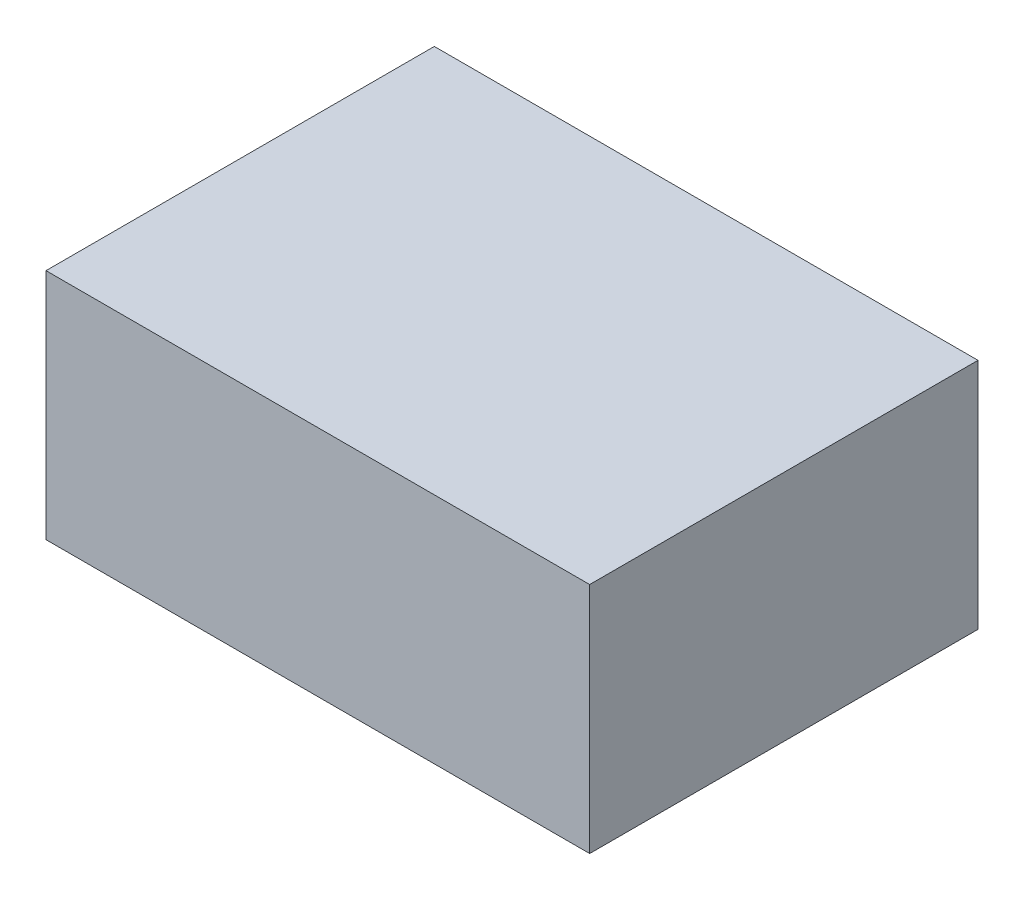
ISO-10303-21;
HEADER;
FILE_DESCRIPTION(('STEP AP214'),'2;1');
FILE_NAME('part.step','',(''),(''),'','','');
FILE_SCHEMA(('AUTOMOTIVE_DESIGN { 1 0 10303 214 1 1 1 1 }'));
ENDSEC;
DATA;
#1=APPLICATION_CONTEXT('core data for automotive mechanical design processes');
#2=APPLICATION_PROTOCOL_DEFINITION('international standard','automotive_design',2000,#1);
#3=PRODUCT_CONTEXT('',#1,'mechanical');
#4=PRODUCT('Part','Part','',(#3));
#5=PRODUCT_RELATED_PRODUCT_CATEGORY('part','',(#4));
#6=PRODUCT_DEFINITION_FORMATION('','',#4);
#7=PRODUCT_DEFINITION_CONTEXT('part definition',#1,'design');
#8=PRODUCT_DEFINITION('design','',#6,#7);
#9=PRODUCT_DEFINITION_SHAPE('','',#8);
#10=(LENGTH_UNIT() NAMED_UNIT(*) SI_UNIT(.MILLI.,.METRE.));
#11=(NAMED_UNIT(*) PLANE_ANGLE_UNIT() SI_UNIT($,.RADIAN.));
#12=(NAMED_UNIT(*) SI_UNIT($,.STERADIAN.) SOLID_ANGLE_UNIT());
#13=UNCERTAINTY_MEASURE_WITH_UNIT(LENGTH_MEASURE(1.E-05),#10,'distance_accuracy_value','');
#14=(GEOMETRIC_REPRESENTATION_CONTEXT(3) GLOBAL_UNCERTAINTY_ASSIGNED_CONTEXT((#13)) GLOBAL_UNIT_ASSIGNED_CONTEXT((#10,
#11,#12)) REPRESENTATION_CONTEXT('',''));
#15=CARTESIAN_POINT('',(0.,0.,0.));
#16=DIRECTION('',(0.,0.,1.));
#17=DIRECTION('',(1.,0.,0.));
#18=AXIS2_PLACEMENT_3D('',#15,#16,#17);
#19=CARTESIAN_POINT('',(-35.,30.,-25.));
#20=DIRECTION('',(1.,0.,0.));
#21=DIRECTION('',(0.,0.,-1.));
#22=AXIS2_PLACEMENT_3D('',#19,#20,#21);
#23=PLANE('',#22);
#24=DIRECTION('',(0.,0.,1.));
#25=VECTOR('',#24,1.);
#26=CARTESIAN_POINT('',(-35.,0.,-25.));
#27=LINE('',#26,#25);
#28=CARTESIAN_POINT('',(-35.,0.,-25.));
#29=VERTEX_POINT('',#28);
#30=CARTESIAN_POINT('',(-35.,0.,25.));
#31=VERTEX_POINT('',#30);
#32=EDGE_CURVE('E98',#29,#31,#27,.T.);
#33=ORIENTED_EDGE('',*,*,#32,.T.);
#34=DIRECTION('',(0.,-1.,0.));
#35=VECTOR('',#34,1.);
#36=CARTESIAN_POINT('',(-35.,30.,25.));
#37=LINE('',#36,#35);
#38=CARTESIAN_POINT('',(-35.,30.,25.));
#39=VERTEX_POINT('',#38);
#40=EDGE_CURVE('E11',#39,#31,#37,.T.);
#41=ORIENTED_EDGE('',*,*,#40,.F.);
#42=DIRECTION('',(0.,0.,1.));
#43=VECTOR('',#42,1.);
#44=CARTESIAN_POINT('',(-35.,30.,-25.));
#45=LINE('',#44,#43);
#46=CARTESIAN_POINT('',(-35.,30.,-25.));
#47=VERTEX_POINT('',#46);
#48=EDGE_CURVE('E86',#47,#39,#45,.T.);
#49=ORIENTED_EDGE('',*,*,#48,.F.);
#50=DIRECTION('',(0.,-1.,0.));
#51=VECTOR('',#50,1.);
#52=CARTESIAN_POINT('',(-35.,30.,-25.));
#53=LINE('',#52,#51);
#54=EDGE_CURVE('E94',#47,#29,#53,.T.);
#55=ORIENTED_EDGE('',*,*,#54,.T.);
#56=EDGE_LOOP('',(#33,#41,#49,#55));
#57=FACE_BOUND('',#56,.T.);
#58=ADVANCED_FACE('F35',(#57),#23,.F.);
#59=CARTESIAN_POINT('',(-35.,30.,25.));
#60=DIRECTION('',(0.,0.,-1.));
#61=DIRECTION('',(-1.,0.,0.));
#62=AXIS2_PLACEMENT_3D('',#59,#60,#61);
#63=PLANE('',#62);
#64=DIRECTION('',(1.,0.,0.));
#65=VECTOR('',#64,1.);
#66=CARTESIAN_POINT('',(-35.,0.,25.));
#67=LINE('',#66,#65);
#68=CARTESIAN_POINT('',(35.,0.,25.));
#69=VERTEX_POINT('',#68);
#70=EDGE_CURVE('E90',#31,#69,#67,.T.);
#71=ORIENTED_EDGE('',*,*,#70,.T.);
#72=DIRECTION('',(0.,-1.,0.));
#73=VECTOR('',#72,1.);
#74=CARTESIAN_POINT('',(35.,30.,25.));
#75=LINE('',#74,#73);
#76=CARTESIAN_POINT('',(35.,30.,25.));
#77=VERTEX_POINT('',#76);
#78=EDGE_CURVE('E43',#77,#69,#75,.T.);
#79=ORIENTED_EDGE('',*,*,#78,.F.);
#80=DIRECTION('',(1.,0.,0.));
#81=VECTOR('',#80,1.);
#82=CARTESIAN_POINT('',(-35.,30.,25.));
#83=LINE('',#82,#81);
#84=EDGE_CURVE('E81',#39,#77,#83,.T.);
#85=ORIENTED_EDGE('',*,*,#84,.F.);
#86=ORIENTED_EDGE('',*,*,#40,.T.);
#87=EDGE_LOOP('',(#71,#79,#85,#86));
#88=FACE_BOUND('',#87,.T.);
#89=ADVANCED_FACE('F89',(#88),#63,.F.);
#90=CARTESIAN_POINT('',(35.,30.,-25.));
#91=DIRECTION('',(-1.,0.,0.));
#92=DIRECTION('',(0.,0.,1.));
#93=AXIS2_PLACEMENT_3D('',#90,#91,#92);
#94=PLANE('',#93);
#95=DIRECTION('',(0.,0.,-1.));
#96=VECTOR('',#95,1.);
#97=CARTESIAN_POINT('',(35.,0.,-25.));
#98=LINE('',#97,#96);
#99=CARTESIAN_POINT('',(35.,0.,-25.));
#100=VERTEX_POINT('',#99);
#101=EDGE_CURVE('E68',#69,#100,#98,.T.);
#102=ORIENTED_EDGE('',*,*,#101,.T.);
#103=DIRECTION('',(0.,-1.,0.));
#104=VECTOR('',#103,1.);
#105=CARTESIAN_POINT('',(35.,30.,-25.));
#106=LINE('',#105,#104);
#107=CARTESIAN_POINT('',(35.,30.,-25.));
#108=VERTEX_POINT('',#107);
#109=EDGE_CURVE('E91',#108,#100,#106,.T.);
#110=ORIENTED_EDGE('',*,*,#109,.F.);
#111=DIRECTION('',(0.,0.,-1.));
#112=VECTOR('',#111,1.);
#113=CARTESIAN_POINT('',(35.,30.,-25.));
#114=LINE('',#113,#112);
#115=EDGE_CURVE('E84',#77,#108,#114,.T.);
#116=ORIENTED_EDGE('',*,*,#115,.F.);
#117=ORIENTED_EDGE('',*,*,#78,.T.);
#118=EDGE_LOOP('',(#102,#110,#116,#117));
#119=FACE_BOUND('',#118,.T.);
#120=ADVANCED_FACE('F92',(#119),#94,.F.);
#121=CARTESIAN_POINT('',(-35.,30.,-25.));
#122=DIRECTION('',(0.,0.,1.));
#123=DIRECTION('',(1.,0.,0.));
#124=AXIS2_PLACEMENT_3D('',#121,#122,#123);
#125=PLANE('',#124);
#126=DIRECTION('',(-1.,0.,0.));
#127=VECTOR('',#126,1.);
#128=CARTESIAN_POINT('',(-35.,0.,-25.));
#129=LINE('',#128,#127);
#130=EDGE_CURVE('E74',#100,#29,#129,.T.);
#131=ORIENTED_EDGE('',*,*,#130,.T.);
#132=ORIENTED_EDGE('',*,*,#54,.F.);
#133=DIRECTION('',(-1.,0.,0.));
#134=VECTOR('',#133,1.);
#135=CARTESIAN_POINT('',(-35.,30.,-25.));
#136=LINE('',#135,#134);
#137=EDGE_CURVE('E51',#108,#47,#136,.T.);
#138=ORIENTED_EDGE('',*,*,#137,.F.);
#139=ORIENTED_EDGE('',*,*,#109,.T.);
#140=EDGE_LOOP('',(#131,#132,#138,#139));
#141=FACE_BOUND('',#140,.T.);
#142=ADVANCED_FACE('F105',(#141),#125,.F.);
#143=CARTESIAN_POINT('',(0.,30.,0.));
#144=DIRECTION('',(0.,1.,0.));
#145=DIRECTION('',(0.,0.,1.));
#146=AXIS2_PLACEMENT_3D('',#143,#144,#145);
#147=PLANE('',#146);
#148=ORIENTED_EDGE('',*,*,#48,.T.);
#149=ORIENTED_EDGE('',*,*,#84,.T.);
#150=ORIENTED_EDGE('',*,*,#115,.T.);
#151=ORIENTED_EDGE('',*,*,#137,.T.);
#152=EDGE_LOOP('',(#148,#149,#150,#151));
#153=FACE_BOUND('',#152,.T.);
#154=ADVANCED_FACE('F82',(#153),#147,.T.);
#155=CARTESIAN_POINT('',(0.,0.,0.));
#156=DIRECTION('',(0.,1.,0.));
#157=DIRECTION('',(0.,0.,1.));
#158=AXIS2_PLACEMENT_3D('',#155,#156,#157);
#159=PLANE('',#158);
#160=ORIENTED_EDGE('',*,*,#32,.F.);
#161=ORIENTED_EDGE('',*,*,#130,.F.);
#162=ORIENTED_EDGE('',*,*,#101,.F.);
#163=ORIENTED_EDGE('',*,*,#70,.F.);
#164=EDGE_LOOP('',(#160,#161,#162,#163));
#165=FACE_BOUND('',#164,.T.);
#166=ADVANCED_FACE('F108',(#165),#159,.F.);
#167=CLOSED_SHELL('',(#58,#89,#120,#142,#154,#166));
#168=MANIFOLD_SOLID_BREP('B2',#167);
#169=ADVANCED_BREP_SHAPE_REPRESENTATION('',(#18,#168),#14);
#170=SHAPE_DEFINITION_REPRESENTATION(#9,#169);
ENDSEC;
END-ISO-10303-21;
